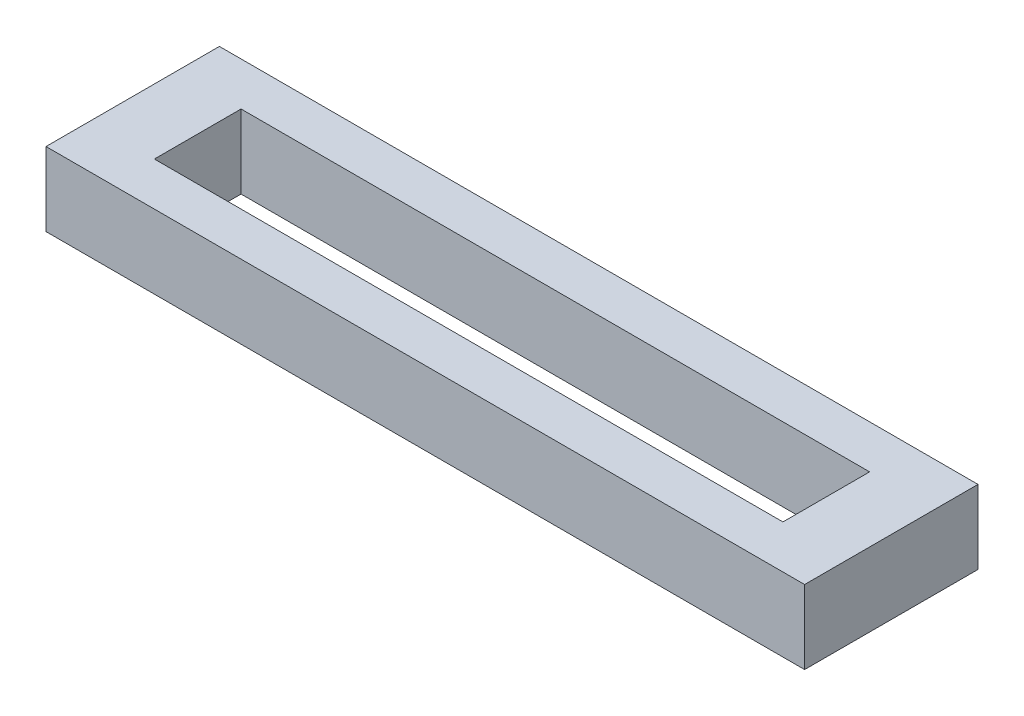
ISO-10303-21;
HEADER;
FILE_DESCRIPTION(('STEP AP214'),'2;1');
FILE_NAME('part.step','',(''),(''),'','','');
FILE_SCHEMA(('AUTOMOTIVE_DESIGN { 1 0 10303 214 1 1 1 1 }'));
ENDSEC;
DATA;
#1=APPLICATION_CONTEXT('core data for automotive mechanical design processes');
#2=APPLICATION_PROTOCOL_DEFINITION('international standard','automotive_design',2000,#1);
#3=PRODUCT_CONTEXT('',#1,'mechanical');
#4=PRODUCT('Part','Part','',(#3));
#5=PRODUCT_RELATED_PRODUCT_CATEGORY('part','',(#4));
#6=PRODUCT_DEFINITION_FORMATION('','',#4);
#7=PRODUCT_DEFINITION_CONTEXT('part definition',#1,'design');
#8=PRODUCT_DEFINITION('design','',#6,#7);
#9=PRODUCT_DEFINITION_SHAPE('','',#8);
#10=(LENGTH_UNIT() NAMED_UNIT(*) SI_UNIT(.MILLI.,.METRE.));
#11=(NAMED_UNIT(*) PLANE_ANGLE_UNIT() SI_UNIT($,.RADIAN.));
#12=(NAMED_UNIT(*) SI_UNIT($,.STERADIAN.) SOLID_ANGLE_UNIT());
#13=UNCERTAINTY_MEASURE_WITH_UNIT(LENGTH_MEASURE(1.E-05),#10,'distance_accuracy_value','');
#14=(GEOMETRIC_REPRESENTATION_CONTEXT(3) GLOBAL_UNCERTAINTY_ASSIGNED_CONTEXT((#13)) GLOBAL_UNIT_ASSIGNED_CONTEXT((#10,
#11,#12)) REPRESENTATION_CONTEXT('',''));
#15=CARTESIAN_POINT('',(0.,0.,0.));
#16=DIRECTION('',(0.,0.,1.));
#17=DIRECTION('',(1.,0.,0.));
#18=AXIS2_PLACEMENT_3D('',#15,#16,#17);
#19=CARTESIAN_POINT('',(0.,3.4,0.));
#20=DIRECTION('',(0.,1.,0.));
#21=DIRECTION('',(0.,0.,1.));
#22=AXIS2_PLACEMENT_3D('',#19,#20,#21);
#23=PLANE('',#22);
#24=DIRECTION('',(0.,0.,-1.));
#25=VECTOR('',#24,1.);
#26=CARTESIAN_POINT('',(17.5,3.4,-4.));
#27=LINE('',#26,#25);
#28=CARTESIAN_POINT('',(17.5,3.4,4.));
#29=VERTEX_POINT('',#28);
#30=CARTESIAN_POINT('',(17.5,3.4,-4.));
#31=VERTEX_POINT('',#30);
#32=EDGE_CURVE('E153',#29,#31,#27,.T.);
#33=ORIENTED_EDGE('',*,*,#32,.T.);
#34=DIRECTION('',(-1.,0.,0.));
#35=VECTOR('',#34,1.);
#36=CARTESIAN_POINT('',(-17.5,3.4,-4.));
#37=LINE('',#36,#35);
#38=CARTESIAN_POINT('',(-17.5,3.4,-4.));
#39=VERTEX_POINT('',#38);
#40=EDGE_CURVE('E157',#31,#39,#37,.T.);
#41=ORIENTED_EDGE('',*,*,#40,.T.);
#42=DIRECTION('',(0.,0.,1.));
#43=VECTOR('',#42,1.);
#44=CARTESIAN_POINT('',(-17.5,3.4,-4.));
#45=LINE('',#44,#43);
#46=CARTESIAN_POINT('',(-17.5,3.4,4.));
#47=VERTEX_POINT('',#46);
#48=EDGE_CURVE('E161',#39,#47,#45,.T.);
#49=ORIENTED_EDGE('',*,*,#48,.T.);
#50=DIRECTION('',(1.,0.,0.));
#51=VECTOR('',#50,1.);
#52=CARTESIAN_POINT('',(-17.5,3.4,4.));
#53=LINE('',#52,#51);
#54=EDGE_CURVE('E164',#47,#29,#53,.T.);
#55=ORIENTED_EDGE('',*,*,#54,.T.);
#56=EDGE_LOOP('',(#33,#41,#49,#55));
#57=FACE_BOUND('',#56,.T.);
#58=DIRECTION('',(-1.,0.,0.));
#59=VECTOR('',#58,1.);
#60=CARTESIAN_POINT('',(-14.5,3.4,-2.));
#61=LINE('',#60,#59);
#62=CARTESIAN_POINT('',(14.5,3.4,-2.));
#63=VERTEX_POINT('',#62);
#64=CARTESIAN_POINT('',(-14.5,3.4,-2.));
#65=VERTEX_POINT('',#64);
#66=EDGE_CURVE('E114',#63,#65,#61,.T.);
#67=ORIENTED_EDGE('',*,*,#66,.F.);
#68=DIRECTION('',(0.,0.,-1.));
#69=VECTOR('',#68,1.);
#70=CARTESIAN_POINT('',(14.5,3.4,-2.));
#71=LINE('',#70,#69);
#72=CARTESIAN_POINT('',(14.5,3.4,2.));
#73=VERTEX_POINT('',#72);
#74=EDGE_CURVE('E105',#73,#63,#71,.T.);
#75=ORIENTED_EDGE('',*,*,#74,.F.);
#76=DIRECTION('',(1.,0.,0.));
#77=VECTOR('',#76,1.);
#78=CARTESIAN_POINT('',(-14.5,3.4,2.));
#79=LINE('',#78,#77);
#80=CARTESIAN_POINT('',(-14.5,3.4,2.));
#81=VERTEX_POINT('',#80);
#82=EDGE_CURVE('E131',#81,#73,#79,.T.);
#83=ORIENTED_EDGE('',*,*,#82,.F.);
#84=DIRECTION('',(0.,0.,1.));
#85=VECTOR('',#84,1.);
#86=CARTESIAN_POINT('',(-14.5,3.4,-2.));
#87=LINE('',#86,#85);
#88=EDGE_CURVE('E127',#65,#81,#87,.T.);
#89=ORIENTED_EDGE('',*,*,#88,.F.);
#90=EDGE_LOOP('',(#67,#75,#83,#89));
#91=FACE_BOUND('',#90,.T.);
#92=ADVANCED_FACE('F39',(#57,#91),#23,.T.);
#93=CARTESIAN_POINT('',(0.,0.,0.));
#94=DIRECTION('',(0.,1.,0.));
#95=DIRECTION('',(0.,0.,1.));
#96=AXIS2_PLACEMENT_3D('',#93,#94,#95);
#97=PLANE('',#96);
#98=DIRECTION('',(0.,0.,-1.));
#99=VECTOR('',#98,1.);
#100=CARTESIAN_POINT('',(17.5,0.,-4.));
#101=LINE('',#100,#99);
#102=CARTESIAN_POINT('',(17.5,0.,4.));
#103=VERTEX_POINT('',#102);
#104=CARTESIAN_POINT('',(17.5,0.,-4.));
#105=VERTEX_POINT('',#104);
#106=EDGE_CURVE('E123',#103,#105,#101,.T.);
#107=ORIENTED_EDGE('',*,*,#106,.F.);
#108=DIRECTION('',(1.,0.,0.));
#109=VECTOR('',#108,1.);
#110=CARTESIAN_POINT('',(-17.5,0.,4.));
#111=LINE('',#110,#109);
#112=CARTESIAN_POINT('',(-17.5,0.,4.));
#113=VERTEX_POINT('',#112);
#114=EDGE_CURVE('E158',#113,#103,#111,.T.);
#115=ORIENTED_EDGE('',*,*,#114,.F.);
#116=DIRECTION('',(0.,0.,1.));
#117=VECTOR('',#116,1.);
#118=CARTESIAN_POINT('',(-17.5,0.,-4.));
#119=LINE('',#118,#117);
#120=CARTESIAN_POINT('',(-17.5,0.,-4.));
#121=VERTEX_POINT('',#120);
#122=EDGE_CURVE('E174',#121,#113,#119,.T.);
#123=ORIENTED_EDGE('',*,*,#122,.F.);
#124=DIRECTION('',(-1.,0.,0.));
#125=VECTOR('',#124,1.);
#126=CARTESIAN_POINT('',(-17.5,0.,-4.));
#127=LINE('',#126,#125);
#128=EDGE_CURVE('E171',#105,#121,#127,.T.);
#129=ORIENTED_EDGE('',*,*,#128,.F.);
#130=EDGE_LOOP('',(#107,#115,#123,#129));
#131=FACE_BOUND('',#130,.T.);
#132=DIRECTION('',(0.,0.,-1.));
#133=VECTOR('',#132,1.);
#134=CARTESIAN_POINT('',(14.5,0.,-2.));
#135=LINE('',#134,#133);
#136=CARTESIAN_POINT('',(14.5,0.,2.));
#137=VERTEX_POINT('',#136);
#138=CARTESIAN_POINT('',(14.5,0.,-2.));
#139=VERTEX_POINT('',#138);
#140=EDGE_CURVE('E63',#137,#139,#135,.T.);
#141=ORIENTED_EDGE('',*,*,#140,.T.);
#142=DIRECTION('',(-1.,0.,0.));
#143=VECTOR('',#142,1.);
#144=CARTESIAN_POINT('',(-14.5,0.,-2.));
#145=LINE('',#144,#143);
#146=CARTESIAN_POINT('',(-14.5,0.,-2.));
#147=VERTEX_POINT('',#146);
#148=EDGE_CURVE('E121',#139,#147,#145,.T.);
#149=ORIENTED_EDGE('',*,*,#148,.T.);
#150=DIRECTION('',(0.,0.,1.));
#151=VECTOR('',#150,1.);
#152=CARTESIAN_POINT('',(-14.5,0.,-2.));
#153=LINE('',#152,#151);
#154=CARTESIAN_POINT('',(-14.5,0.,2.));
#155=VERTEX_POINT('',#154);
#156=EDGE_CURVE('E140',#147,#155,#153,.T.);
#157=ORIENTED_EDGE('',*,*,#156,.T.);
#158=DIRECTION('',(1.,0.,0.));
#159=VECTOR('',#158,1.);
#160=CARTESIAN_POINT('',(-14.5,0.,2.));
#161=LINE('',#160,#159);
#162=EDGE_CURVE('E115',#155,#137,#161,.T.);
#163=ORIENTED_EDGE('',*,*,#162,.T.);
#164=EDGE_LOOP('',(#141,#149,#157,#163));
#165=FACE_BOUND('',#164,.T.);
#166=ADVANCED_FACE('F197',(#131,#165),#97,.F.);
#167=CARTESIAN_POINT('',(17.5,3.4,-4.));
#168=DIRECTION('',(-1.,0.,0.));
#169=DIRECTION('',(0.,0.,1.));
#170=AXIS2_PLACEMENT_3D('',#167,#168,#169);
#171=PLANE('',#170);
#172=ORIENTED_EDGE('',*,*,#106,.T.);
#173=DIRECTION('',(0.,-1.,0.));
#174=VECTOR('',#173,1.);
#175=CARTESIAN_POINT('',(17.5,3.4,-4.));
#176=LINE('',#175,#174);
#177=EDGE_CURVE('E11',#31,#105,#176,.T.);
#178=ORIENTED_EDGE('',*,*,#177,.F.);
#179=ORIENTED_EDGE('',*,*,#32,.F.);
#180=DIRECTION('',(0.,-1.,0.));
#181=VECTOR('',#180,1.);
#182=CARTESIAN_POINT('',(17.5,3.4,4.));
#183=LINE('',#182,#181);
#184=EDGE_CURVE('E167',#29,#103,#183,.T.);
#185=ORIENTED_EDGE('',*,*,#184,.T.);
#186=EDGE_LOOP('',(#172,#178,#179,#185));
#187=FACE_BOUND('',#186,.T.);
#188=ADVANCED_FACE('F41',(#187),#171,.F.);
#189=CARTESIAN_POINT('',(-17.5,3.4,-4.));
#190=DIRECTION('',(0.,0.,1.));
#191=DIRECTION('',(1.,0.,0.));
#192=AXIS2_PLACEMENT_3D('',#189,#190,#191);
#193=PLANE('',#192);
#194=ORIENTED_EDGE('',*,*,#128,.T.);
#195=DIRECTION('',(0.,-1.,0.));
#196=VECTOR('',#195,1.);
#197=CARTESIAN_POINT('',(-17.5,3.4,-4.));
#198=LINE('',#197,#196);
#199=EDGE_CURVE('E48',#39,#121,#198,.T.);
#200=ORIENTED_EDGE('',*,*,#199,.F.);
#201=ORIENTED_EDGE('',*,*,#40,.F.);
#202=ORIENTED_EDGE('',*,*,#177,.T.);
#203=EDGE_LOOP('',(#194,#200,#201,#202));
#204=FACE_BOUND('',#203,.T.);
#205=ADVANCED_FACE('F207',(#204),#193,.F.);
#206=CARTESIAN_POINT('',(-17.5,3.4,-4.));
#207=DIRECTION('',(1.,0.,0.));
#208=DIRECTION('',(0.,0.,-1.));
#209=AXIS2_PLACEMENT_3D('',#206,#207,#208);
#210=PLANE('',#209);
#211=ORIENTED_EDGE('',*,*,#122,.T.);
#212=DIRECTION('',(0.,-1.,0.));
#213=VECTOR('',#212,1.);
#214=CARTESIAN_POINT('',(-17.5,3.4,4.));
#215=LINE('',#214,#213);
#216=EDGE_CURVE('E182',#47,#113,#215,.T.);
#217=ORIENTED_EDGE('',*,*,#216,.F.);
#218=ORIENTED_EDGE('',*,*,#48,.F.);
#219=ORIENTED_EDGE('',*,*,#199,.T.);
#220=EDGE_LOOP('',(#211,#217,#218,#219));
#221=FACE_BOUND('',#220,.T.);
#222=ADVANCED_FACE('F191',(#221),#210,.F.);
#223=CARTESIAN_POINT('',(-17.5,3.4,4.));
#224=DIRECTION('',(0.,0.,-1.));
#225=DIRECTION('',(-1.,0.,0.));
#226=AXIS2_PLACEMENT_3D('',#223,#224,#225);
#227=PLANE('',#226);
#228=ORIENTED_EDGE('',*,*,#114,.T.);
#229=ORIENTED_EDGE('',*,*,#184,.F.);
#230=ORIENTED_EDGE('',*,*,#54,.F.);
#231=ORIENTED_EDGE('',*,*,#216,.T.);
#232=EDGE_LOOP('',(#228,#229,#230,#231));
#233=FACE_BOUND('',#232,.T.);
#234=ADVANCED_FACE('F201',(#233),#227,.F.);
#235=CARTESIAN_POINT('',(14.5,3.4,-2.));
#236=DIRECTION('',(-1.,0.,0.));
#237=DIRECTION('',(0.,0.,1.));
#238=AXIS2_PLACEMENT_3D('',#235,#236,#237);
#239=PLANE('',#238);
#240=ORIENTED_EDGE('',*,*,#140,.F.);
#241=DIRECTION('',(0.,-1.,0.));
#242=VECTOR('',#241,1.);
#243=CARTESIAN_POINT('',(14.5,3.4,2.));
#244=LINE('',#243,#242);
#245=EDGE_CURVE('E109',#73,#137,#244,.T.);
#246=ORIENTED_EDGE('',*,*,#245,.F.);
#247=ORIENTED_EDGE('',*,*,#74,.T.);
#248=DIRECTION('',(0.,-1.,0.));
#249=VECTOR('',#248,1.);
#250=CARTESIAN_POINT('',(14.5,3.4,-2.));
#251=LINE('',#250,#249);
#252=EDGE_CURVE('E108',#63,#139,#251,.T.);
#253=ORIENTED_EDGE('',*,*,#252,.T.);
#254=EDGE_LOOP('',(#240,#246,#247,#253));
#255=FACE_BOUND('',#254,.T.);
#256=ADVANCED_FACE('F107',(#255),#239,.T.);
#257=CARTESIAN_POINT('',(-14.5,3.4,-2.));
#258=DIRECTION('',(0.,0.,1.));
#259=DIRECTION('',(1.,0.,0.));
#260=AXIS2_PLACEMENT_3D('',#257,#258,#259);
#261=PLANE('',#260);
#262=ORIENTED_EDGE('',*,*,#148,.F.);
#263=ORIENTED_EDGE('',*,*,#252,.F.);
#264=ORIENTED_EDGE('',*,*,#66,.T.);
#265=DIRECTION('',(0.,-1.,0.));
#266=VECTOR('',#265,1.);
#267=CARTESIAN_POINT('',(-14.5,3.4,-2.));
#268=LINE('',#267,#266);
#269=EDGE_CURVE('E124',#65,#147,#268,.T.);
#270=ORIENTED_EDGE('',*,*,#269,.T.);
#271=EDGE_LOOP('',(#262,#263,#264,#270));
#272=FACE_BOUND('',#271,.T.);
#273=ADVANCED_FACE('F118',(#272),#261,.T.);
#274=CARTESIAN_POINT('',(-14.5,3.4,-2.));
#275=DIRECTION('',(1.,0.,0.));
#276=DIRECTION('',(0.,0.,-1.));
#277=AXIS2_PLACEMENT_3D('',#274,#275,#276);
#278=PLANE('',#277);
#279=ORIENTED_EDGE('',*,*,#156,.F.);
#280=ORIENTED_EDGE('',*,*,#269,.F.);
#281=ORIENTED_EDGE('',*,*,#88,.T.);
#282=DIRECTION('',(0.,-1.,0.));
#283=VECTOR('',#282,1.);
#284=CARTESIAN_POINT('',(-14.5,3.4,2.));
#285=LINE('',#284,#283);
#286=EDGE_CURVE('E55',#81,#155,#285,.T.);
#287=ORIENTED_EDGE('',*,*,#286,.T.);
#288=EDGE_LOOP('',(#279,#280,#281,#287));
#289=FACE_BOUND('',#288,.T.);
#290=ADVANCED_FACE('F230',(#289),#278,.T.);
#291=CARTESIAN_POINT('',(-14.5,3.4,2.));
#292=DIRECTION('',(0.,0.,-1.));
#293=DIRECTION('',(-1.,0.,0.));
#294=AXIS2_PLACEMENT_3D('',#291,#292,#293);
#295=PLANE('',#294);
#296=ORIENTED_EDGE('',*,*,#162,.F.);
#297=ORIENTED_EDGE('',*,*,#286,.F.);
#298=ORIENTED_EDGE('',*,*,#82,.T.);
#299=ORIENTED_EDGE('',*,*,#245,.T.);
#300=EDGE_LOOP('',(#296,#297,#298,#299));
#301=FACE_BOUND('',#300,.T.);
#302=ADVANCED_FACE('F234',(#301),#295,.T.);
#303=CLOSED_SHELL('',(#92,#166,#188,#205,#222,#234,#256,#273,#290,#302));
#304=MANIFOLD_SOLID_BREP('B2',#303);
#305=ADVANCED_BREP_SHAPE_REPRESENTATION('',(#18,#304),#14);
#306=SHAPE_DEFINITION_REPRESENTATION(#9,#305);
ENDSEC;
END-ISO-10303-21;
